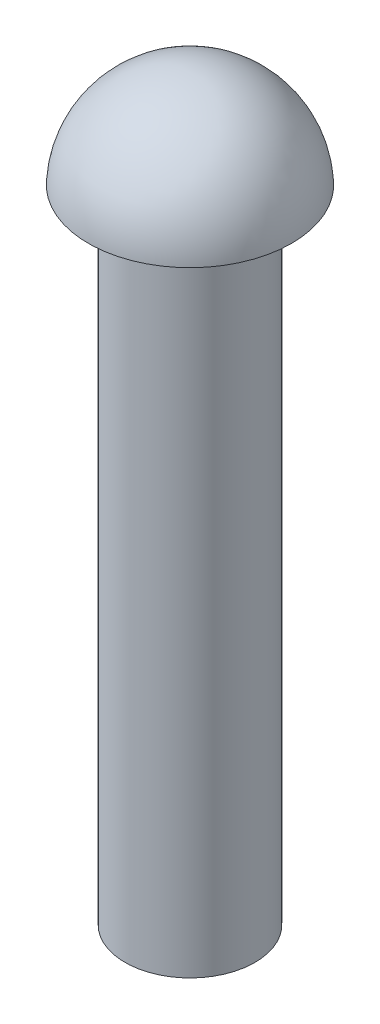
ISO-10303-21;
HEADER;
FILE_DESCRIPTION(('STEP AP214'),'2;1');
FILE_NAME('part.step','',(''),(''),'','','');
FILE_SCHEMA(('AUTOMOTIVE_DESIGN { 1 0 10303 214 1 1 1 1 }'));
ENDSEC;
DATA;
#1=APPLICATION_CONTEXT('core data for automotive mechanical design processes');
#2=APPLICATION_PROTOCOL_DEFINITION('international standard','automotive_design',2000,#1);
#3=PRODUCT_CONTEXT('',#1,'mechanical');
#4=PRODUCT('Part','Part','',(#3));
#5=PRODUCT_RELATED_PRODUCT_CATEGORY('part','',(#4));
#6=PRODUCT_DEFINITION_FORMATION('','',#4);
#7=PRODUCT_DEFINITION_CONTEXT('part definition',#1,'design');
#8=PRODUCT_DEFINITION('design','',#6,#7);
#9=PRODUCT_DEFINITION_SHAPE('','',#8);
#10=(LENGTH_UNIT() NAMED_UNIT(*) SI_UNIT(.MILLI.,.METRE.));
#11=(NAMED_UNIT(*) PLANE_ANGLE_UNIT() SI_UNIT($,.RADIAN.));
#12=(NAMED_UNIT(*) SI_UNIT($,.STERADIAN.) SOLID_ANGLE_UNIT());
#13=UNCERTAINTY_MEASURE_WITH_UNIT(LENGTH_MEASURE(1.E-05),#10,'distance_accuracy_value','');
#14=(GEOMETRIC_REPRESENTATION_CONTEXT(3) GLOBAL_UNCERTAINTY_ASSIGNED_CONTEXT((#13)) GLOBAL_UNIT_ASSIGNED_CONTEXT((#10,
#11,#12)) REPRESENTATION_CONTEXT('',''));
#15=CARTESIAN_POINT('',(0.,0.,0.));
#16=DIRECTION('',(0.,0.,1.));
#17=DIRECTION('',(1.,0.,0.));
#18=AXIS2_PLACEMENT_3D('',#15,#16,#17);
#19=CARTESIAN_POINT('',(0.,0.,0.));
#20=DIRECTION('',(0.,-1.,0.));
#21=DIRECTION('',(0.,0.,-1.));
#22=AXIS2_PLACEMENT_3D('',#19,#20,#21);
#23=PLANE('',#22);
#24=CARTESIAN_POINT('',(0.,0.,0.));
#25=DIRECTION('',(0.,-1.,0.));
#26=DIRECTION('',(0.,0.,-1.));
#27=AXIS2_PLACEMENT_3D('',#24,#25,#26);
#28=CIRCLE('',#27,3.8608);
#29=CARTESIAN_POINT('',(0.,0.,-3.8608));
#30=VERTEX_POINT('',#29);
#31=EDGE_CURVE('E10',#30,#30,#28,.T.);
#32=ORIENTED_EDGE('',*,*,#31,.T.);
#33=EDGE_LOOP('',(#32));
#34=FACE_BOUND('',#33,.T.);
#35=ADVANCED_FACE('F41',(#34),#23,.T.);
#36=CARTESIAN_POINT('',(0.,0.,0.));
#37=DIRECTION('',(0.,-1.,0.));
#38=DIRECTION('',(0.,0.,-1.));
#39=AXIS2_PLACEMENT_3D('',#36,#37,#38);
#40=CYLINDRICAL_SURFACE('',#39,3.8608);
#41=CARTESIAN_POINT('',(0.,38.1,0.));
#42=DIRECTION('',(0.,-1.,0.));
#43=DIRECTION('',(0.,0.,-1.));
#44=AXIS2_PLACEMENT_3D('',#41,#42,#43);
#45=CIRCLE('',#44,3.8608);
#46=CARTESIAN_POINT('',(0.,38.1,-3.8608));
#47=VERTEX_POINT('',#46);
#48=EDGE_CURVE('E48',#47,#47,#45,.T.);
#49=ORIENTED_EDGE('',*,*,#48,.T.);
#50=EDGE_LOOP('',(#49));
#51=FACE_BOUND('',#50,.T.);
#52=ORIENTED_EDGE('',*,*,#31,.F.);
#53=EDGE_LOOP('',(#52));
#54=FACE_BOUND('',#53,.T.);
#55=ADVANCED_FACE('F70',(#51,#54),#40,.T.);
#56=CARTESIAN_POINT('',(3.8608,38.1,0.));
#57=DIRECTION('',(0.,-1.,0.));
#58=DIRECTION('',(0.,0.,-1.));
#59=AXIS2_PLACEMENT_3D('',#56,#57,#58);
#60=PLANE('',#59);
#61=CARTESIAN_POINT('',(0.,38.1,0.));
#62=DIRECTION('',(0.,-1.,0.));
#63=DIRECTION('',(0.,0.,-1.));
#64=AXIS2_PLACEMENT_3D('',#61,#62,#63);
#65=CIRCLE('',#64,6.03986150834603);
#66=CARTESIAN_POINT('',(0.,38.1,-6.03986150834603));
#67=VERTEX_POINT('',#66);
#68=EDGE_CURVE('E53',#67,#67,#65,.T.);
#69=ORIENTED_EDGE('',*,*,#68,.T.);
#70=EDGE_LOOP('',(#69));
#71=FACE_BOUND('',#70,.T.);
#72=ORIENTED_EDGE('',*,*,#48,.F.);
#73=EDGE_LOOP('',(#72));
#74=FACE_BOUND('',#73,.T.);
#75=ADVANCED_FACE('F61',(#71,#74),#60,.T.);
#76=CARTESIAN_POINT('',(0.,37.846,0.));
#77=DIRECTION('',(0.,-1.,0.));
#78=DIRECTION('',(1.,0.,0.));
#79=AXIS2_PLACEMENT_3D('',#76,#77,#78);
#80=SPHERICAL_SURFACE('',#79,6.0452);
#81=ORIENTED_EDGE('',*,*,#68,.F.);
#82=EDGE_LOOP('',(#81));
#83=FACE_BOUND('',#82,.T.);
#84=ADVANCED_FACE('F64',(#83),#80,.T.);
#85=CLOSED_SHELL('',(#35,#55,#75,#84));
#86=MANIFOLD_SOLID_BREP('B2',#85);
#87=ADVANCED_BREP_SHAPE_REPRESENTATION('',(#18,#86),#14);
#88=SHAPE_DEFINITION_REPRESENTATION(#9,#87);
ENDSEC;
END-ISO-10303-21;
